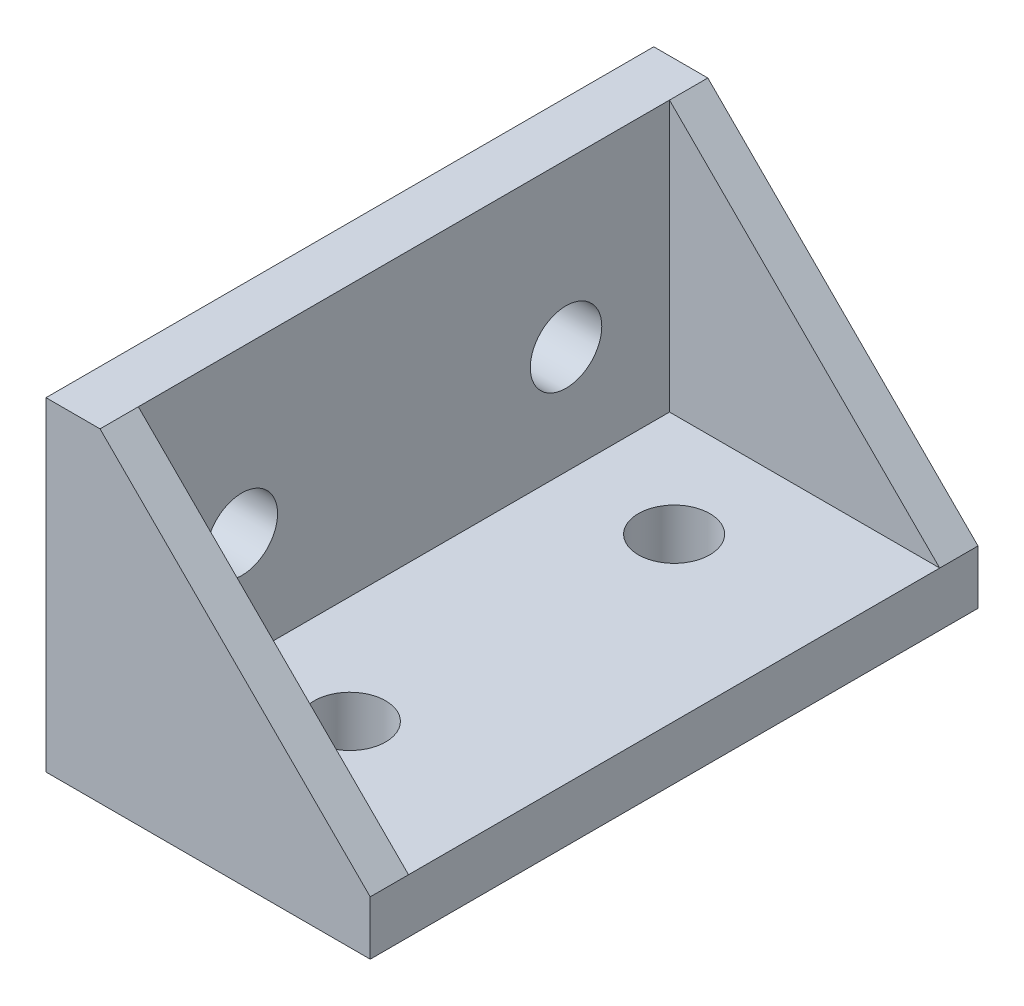
ISO-10303-21;
HEADER;
FILE_DESCRIPTION(('STEP AP214'),'2;1');
FILE_NAME('part.step','',(''),(''),'','','');
FILE_SCHEMA(('AUTOMOTIVE_DESIGN { 1 0 10303 214 1 1 1 1 }'));
ENDSEC;
DATA;
#1=APPLICATION_CONTEXT('core data for automotive mechanical design processes');
#2=APPLICATION_PROTOCOL_DEFINITION('international standard','automotive_design',2000,#1);
#3=PRODUCT_CONTEXT('',#1,'mechanical');
#4=PRODUCT('Part','Part','',(#3));
#5=PRODUCT_RELATED_PRODUCT_CATEGORY('part','',(#4));
#6=PRODUCT_DEFINITION_FORMATION('','',#4);
#7=PRODUCT_DEFINITION_CONTEXT('part definition',#1,'design');
#8=PRODUCT_DEFINITION('design','',#6,#7);
#9=PRODUCT_DEFINITION_SHAPE('','',#8);
#10=(LENGTH_UNIT() NAMED_UNIT(*) SI_UNIT(.MILLI.,.METRE.));
#11=(NAMED_UNIT(*) PLANE_ANGLE_UNIT() SI_UNIT($,.RADIAN.));
#12=(NAMED_UNIT(*) SI_UNIT($,.STERADIAN.) SOLID_ANGLE_UNIT());
#13=UNCERTAINTY_MEASURE_WITH_UNIT(LENGTH_MEASURE(1.E-05),#10,'distance_accuracy_value','');
#14=(GEOMETRIC_REPRESENTATION_CONTEXT(3) GLOBAL_UNCERTAINTY_ASSIGNED_CONTEXT((#13)) GLOBAL_UNIT_ASSIGNED_CONTEXT((#10,
#11,#12)) REPRESENTATION_CONTEXT('',''));
#15=CARTESIAN_POINT('',(0.,0.,0.));
#16=DIRECTION('',(0.,0.,1.));
#17=DIRECTION('',(1.,0.,0.));
#18=AXIS2_PLACEMENT_3D('',#15,#16,#17);
#19=CARTESIAN_POINT('',(38.1,6.35,35.71));
#20=DIRECTION('',(-0.707106781186548,-0.707106781186548,0.));
#21=DIRECTION('',(0.707106781186548,-0.707106781186548,0.));
#22=AXIS2_PLACEMENT_3D('',#19,#20,#21);
#23=PLANE('',#22);
#24=DIRECTION('',(-0.707106781186548,0.707106781186548,0.));
#25=VECTOR('',#24,1.);
#26=CARTESIAN_POINT('',(38.1,6.35,-31.21));
#27=LINE('',#26,#25);
#28=CARTESIAN_POINT('',(38.1,6.35,-31.21));
#29=VERTEX_POINT('',#28);
#30=CARTESIAN_POINT('',(6.35,38.1,-31.21));
#31=VERTEX_POINT('',#30);
#32=EDGE_CURVE('E11',#29,#31,#27,.T.);
#33=ORIENTED_EDGE('',*,*,#32,.F.);
#34=DIRECTION('',(0.,0.,-1.));
#35=VECTOR('',#34,1.);
#36=CARTESIAN_POINT('',(38.1,6.35,35.71));
#37=LINE('',#36,#35);
#38=CARTESIAN_POINT('',(38.1,6.35,-35.71));
#39=VERTEX_POINT('',#38);
#40=EDGE_CURVE('E122',#29,#39,#37,.T.);
#41=ORIENTED_EDGE('',*,*,#40,.T.);
#42=DIRECTION('',(-0.707106781186548,0.707106781186548,0.));
#43=VECTOR('',#42,1.);
#44=CARTESIAN_POINT('',(38.1,6.35,-35.71));
#45=LINE('',#44,#43);
#46=CARTESIAN_POINT('',(6.35,38.1,-35.71));
#47=VERTEX_POINT('',#46);
#48=EDGE_CURVE('E139',#39,#47,#45,.T.);
#49=ORIENTED_EDGE('',*,*,#48,.T.);
#50=DIRECTION('',(0.,0.,-1.));
#51=VECTOR('',#50,1.);
#52=CARTESIAN_POINT('',(6.35,38.1,35.71));
#53=LINE('',#52,#51);
#54=EDGE_CURVE('E145',#31,#47,#53,.T.);
#55=ORIENTED_EDGE('',*,*,#54,.F.);
#56=EDGE_LOOP('',(#33,#41,#49,#55));
#57=FACE_BOUND('',#56,.T.);
#58=ADVANCED_FACE('F39',(#57),#23,.F.);
#59=CARTESIAN_POINT('',(0.,38.1,35.71));
#60=DIRECTION('',(1.,0.,0.));
#61=DIRECTION('',(0.,0.,-1.));
#62=AXIS2_PLACEMENT_3D('',#59,#60,#61);
#63=PLANE('',#62);
#64=CARTESIAN_POINT('',(0.,19.05,-19.05));
#65=DIRECTION('',(1.,0.,0.));
#66=DIRECTION('',(0.,0.,-1.));
#67=AXIS2_PLACEMENT_3D('',#64,#65,#66);
#68=CIRCLE('',#67,4.2);
#69=CARTESIAN_POINT('',(0.,19.05,-23.25));
#70=VERTEX_POINT('',#69);
#71=EDGE_CURVE('E182',#70,#70,#68,.T.);
#72=ORIENTED_EDGE('',*,*,#71,.T.);
#73=EDGE_LOOP('',(#72));
#74=FACE_BOUND('',#73,.T.);
#75=CARTESIAN_POINT('',(0.,19.05,19.05));
#76=DIRECTION('',(1.,0.,0.));
#77=DIRECTION('',(0.,0.,-1.));
#78=AXIS2_PLACEMENT_3D('',#75,#76,#77);
#79=CIRCLE('',#78,4.2);
#80=CARTESIAN_POINT('',(0.,19.05,14.85));
#81=VERTEX_POINT('',#80);
#82=EDGE_CURVE('E190',#81,#81,#79,.T.);
#83=ORIENTED_EDGE('',*,*,#82,.T.);
#84=EDGE_LOOP('',(#83));
#85=FACE_BOUND('',#84,.T.);
#86=DIRECTION('',(0.,-1.,0.));
#87=VECTOR('',#86,1.);
#88=CARTESIAN_POINT('',(0.,38.1,-35.71));
#89=LINE('',#88,#87);
#90=CARTESIAN_POINT('',(0.,38.1,-35.71));
#91=VERTEX_POINT('',#90);
#92=CARTESIAN_POINT('',(0.,0.,-35.71));
#93=VERTEX_POINT('',#92);
#94=EDGE_CURVE('E131',#91,#93,#89,.T.);
#95=ORIENTED_EDGE('',*,*,#94,.T.);
#96=DIRECTION('',(0.,0.,-1.));
#97=VECTOR('',#96,1.);
#98=CARTESIAN_POINT('',(0.,0.,35.71));
#99=LINE('',#98,#97);
#100=CARTESIAN_POINT('',(0.,0.,35.71));
#101=VERTEX_POINT('',#100);
#102=EDGE_CURVE('E149',#101,#93,#99,.T.);
#103=ORIENTED_EDGE('',*,*,#102,.F.);
#104=DIRECTION('',(0.,-1.,0.));
#105=VECTOR('',#104,1.);
#106=CARTESIAN_POINT('',(0.,38.1,35.71));
#107=LINE('',#106,#105);
#108=CARTESIAN_POINT('',(0.,38.1,35.71));
#109=VERTEX_POINT('',#108);
#110=EDGE_CURVE('E143',#109,#101,#107,.T.);
#111=ORIENTED_EDGE('',*,*,#110,.F.);
#112=DIRECTION('',(0.,0.,-1.));
#113=VECTOR('',#112,1.);
#114=CARTESIAN_POINT('',(0.,38.1,35.71));
#115=LINE('',#114,#113);
#116=EDGE_CURVE('E127',#109,#91,#115,.T.);
#117=ORIENTED_EDGE('',*,*,#116,.T.);
#118=EDGE_LOOP('',(#95,#103,#111,#117));
#119=FACE_BOUND('',#118,.T.);
#120=ADVANCED_FACE('F41',(#74,#85,#119),#63,.F.);
#121=CARTESIAN_POINT('',(0.,0.,35.71));
#122=DIRECTION('',(0.,1.,0.));
#123=DIRECTION('',(0.,0.,1.));
#124=AXIS2_PLACEMENT_3D('',#121,#122,#123);
#125=PLANE('',#124);
#126=CARTESIAN_POINT('',(19.05,0.,-19.05));
#127=DIRECTION('',(0.,1.,0.));
#128=DIRECTION('',(0.,0.,1.));
#129=AXIS2_PLACEMENT_3D('',#126,#127,#128);
#130=CIRCLE('',#129,4.2);
#131=CARTESIAN_POINT('',(19.05,0.,-14.85));
#132=VERTEX_POINT('',#131);
#133=EDGE_CURVE('E174',#132,#132,#130,.T.);
#134=ORIENTED_EDGE('',*,*,#133,.T.);
#135=EDGE_LOOP('',(#134));
#136=FACE_BOUND('',#135,.T.);
#137=CARTESIAN_POINT('',(19.05,0.,19.05));
#138=DIRECTION('',(0.,1.,0.));
#139=DIRECTION('',(0.,0.,1.));
#140=AXIS2_PLACEMENT_3D('',#137,#138,#139);
#141=CIRCLE('',#140,4.2);
#142=CARTESIAN_POINT('',(19.05,0.,23.25));
#143=VERTEX_POINT('',#142);
#144=EDGE_CURVE('E178',#143,#143,#141,.T.);
#145=ORIENTED_EDGE('',*,*,#144,.T.);
#146=EDGE_LOOP('',(#145));
#147=FACE_BOUND('',#146,.T.);
#148=DIRECTION('',(1.,0.,0.));
#149=VECTOR('',#148,1.);
#150=CARTESIAN_POINT('',(0.,0.,-35.71));
#151=LINE('',#150,#149);
#152=CARTESIAN_POINT('',(38.1,0.,-35.71));
#153=VERTEX_POINT('',#152);
#154=EDGE_CURVE('E134',#93,#153,#151,.T.);
#155=ORIENTED_EDGE('',*,*,#154,.T.);
#156=DIRECTION('',(0.,0.,-1.));
#157=VECTOR('',#156,1.);
#158=CARTESIAN_POINT('',(38.1,0.,35.71));
#159=LINE('',#158,#157);
#160=CARTESIAN_POINT('',(38.1,0.,35.71));
#161=VERTEX_POINT('',#160);
#162=EDGE_CURVE('E120',#161,#153,#159,.T.);
#163=ORIENTED_EDGE('',*,*,#162,.F.);
#164=DIRECTION('',(1.,0.,0.));
#165=VECTOR('',#164,1.);
#166=CARTESIAN_POINT('',(0.,0.,35.71));
#167=LINE('',#166,#165);
#168=EDGE_CURVE('E94',#101,#161,#167,.T.);
#169=ORIENTED_EDGE('',*,*,#168,.F.);
#170=ORIENTED_EDGE('',*,*,#102,.T.);
#171=EDGE_LOOP('',(#155,#163,#169,#170));
#172=FACE_BOUND('',#171,.T.);
#173=ADVANCED_FACE('F241',(#136,#147,#172),#125,.F.);
#174=CARTESIAN_POINT('',(38.1,0.,35.71));
#175=DIRECTION('',(-1.,0.,0.));
#176=DIRECTION('',(0.,0.,1.));
#177=AXIS2_PLACEMENT_3D('',#174,#175,#176);
#178=PLANE('',#177);
#179=DIRECTION('',(0.,1.,0.));
#180=VECTOR('',#179,1.);
#181=CARTESIAN_POINT('',(38.1,0.,-35.71));
#182=LINE('',#181,#180);
#183=EDGE_CURVE('E137',#153,#39,#182,.T.);
#184=ORIENTED_EDGE('',*,*,#183,.T.);
#185=ORIENTED_EDGE('',*,*,#40,.F.);
#186=CARTESIAN_POINT('',(38.1,6.35,31.21));
#187=VERTEX_POINT('',#186);
#188=EDGE_CURVE('E117',#187,#29,#37,.T.);
#189=ORIENTED_EDGE('',*,*,#188,.F.);
#190=CARTESIAN_POINT('',(38.1,6.35,35.71));
#191=VERTEX_POINT('',#190);
#192=EDGE_CURVE('E111',#191,#187,#37,.T.);
#193=ORIENTED_EDGE('',*,*,#192,.F.);
#194=DIRECTION('',(0.,1.,0.));
#195=VECTOR('',#194,1.);
#196=CARTESIAN_POINT('',(38.1,0.,35.71));
#197=LINE('',#196,#195);
#198=EDGE_CURVE('E100',#161,#191,#197,.T.);
#199=ORIENTED_EDGE('',*,*,#198,.F.);
#200=ORIENTED_EDGE('',*,*,#162,.T.);
#201=EDGE_LOOP('',(#184,#185,#189,#193,#199,#200));
#202=FACE_BOUND('',#201,.T.);
#203=ADVANCED_FACE('F113',(#202),#178,.F.);
#204=ORIENTED_EDGE('',*,*,#192,.T.);
#205=DIRECTION('',(-0.707106781186548,0.707106781186548,0.));
#206=VECTOR('',#205,1.);
#207=CARTESIAN_POINT('',(38.1,6.35,31.21));
#208=LINE('',#207,#206);
#209=CARTESIAN_POINT('',(6.35,38.1,31.21));
#210=VERTEX_POINT('',#209);
#211=EDGE_CURVE('E47',#187,#210,#208,.T.);
#212=ORIENTED_EDGE('',*,*,#211,.T.);
#213=CARTESIAN_POINT('',(6.35,38.1,35.71));
#214=VERTEX_POINT('',#213);
#215=EDGE_CURVE('E125',#214,#210,#53,.T.);
#216=ORIENTED_EDGE('',*,*,#215,.F.);
#217=DIRECTION('',(-0.707106781186548,0.707106781186548,0.));
#218=VECTOR('',#217,1.);
#219=CARTESIAN_POINT('',(38.1,6.35,35.71));
#220=LINE('',#219,#218);
#221=EDGE_CURVE('E104',#191,#214,#220,.T.);
#222=ORIENTED_EDGE('',*,*,#221,.F.);
#223=EDGE_LOOP('',(#204,#212,#216,#222));
#224=FACE_BOUND('',#223,.T.);
#225=ADVANCED_FACE('F123',(#224),#23,.F.);
#226=CARTESIAN_POINT('',(6.35,38.1,35.71));
#227=DIRECTION('',(0.,-1.,0.));
#228=DIRECTION('',(0.,0.,-1.));
#229=AXIS2_PLACEMENT_3D('',#226,#227,#228);
#230=PLANE('',#229);
#231=DIRECTION('',(-1.,0.,0.));
#232=VECTOR('',#231,1.);
#233=CARTESIAN_POINT('',(6.35,38.1,-35.71));
#234=LINE('',#233,#232);
#235=EDGE_CURVE('E85',#47,#91,#234,.T.);
#236=ORIENTED_EDGE('',*,*,#235,.T.);
#237=ORIENTED_EDGE('',*,*,#116,.F.);
#238=DIRECTION('',(-1.,0.,0.));
#239=VECTOR('',#238,1.);
#240=CARTESIAN_POINT('',(6.35,38.1,35.71));
#241=LINE('',#240,#239);
#242=EDGE_CURVE('E62',#214,#109,#241,.T.);
#243=ORIENTED_EDGE('',*,*,#242,.F.);
#244=ORIENTED_EDGE('',*,*,#215,.T.);
#245=EDGE_CURVE('E146',#210,#31,#53,.T.);
#246=ORIENTED_EDGE('',*,*,#245,.T.);
#247=ORIENTED_EDGE('',*,*,#54,.T.);
#248=EDGE_LOOP('',(#236,#237,#243,#244,#246,#247));
#249=FACE_BOUND('',#248,.T.);
#250=ADVANCED_FACE('F159',(#249),#230,.F.);
#251=CARTESIAN_POINT('',(0.,0.,35.71));
#252=DIRECTION('',(0.,0.,1.));
#253=DIRECTION('',(1.,0.,0.));
#254=AXIS2_PLACEMENT_3D('',#251,#252,#253);
#255=PLANE('',#254);
#256=ORIENTED_EDGE('',*,*,#110,.T.);
#257=ORIENTED_EDGE('',*,*,#168,.T.);
#258=ORIENTED_EDGE('',*,*,#198,.T.);
#259=ORIENTED_EDGE('',*,*,#221,.T.);
#260=ORIENTED_EDGE('',*,*,#242,.T.);
#261=EDGE_LOOP('',(#256,#257,#258,#259,#260));
#262=FACE_BOUND('',#261,.T.);
#263=ADVANCED_FACE('F102',(#262),#255,.T.);
#264=CARTESIAN_POINT('',(0.,0.,-35.71));
#265=DIRECTION('',(0.,0.,1.));
#266=DIRECTION('',(1.,0.,0.));
#267=AXIS2_PLACEMENT_3D('',#264,#265,#266);
#268=PLANE('',#267);
#269=ORIENTED_EDGE('',*,*,#94,.F.);
#270=ORIENTED_EDGE('',*,*,#235,.F.);
#271=ORIENTED_EDGE('',*,*,#48,.F.);
#272=ORIENTED_EDGE('',*,*,#183,.F.);
#273=ORIENTED_EDGE('',*,*,#154,.F.);
#274=EDGE_LOOP('',(#269,#270,#271,#272,#273));
#275=FACE_BOUND('',#274,.T.);
#276=ADVANCED_FACE('F261',(#275),#268,.F.);
#277=CARTESIAN_POINT('',(6.35,6.35,-31.21));
#278=DIRECTION('',(0.,-1.,0.));
#279=DIRECTION('',(0.,0.,-1.));
#280=AXIS2_PLACEMENT_3D('',#277,#278,#279);
#281=PLANE('',#280);
#282=CARTESIAN_POINT('',(19.05,6.35,-19.05));
#283=DIRECTION('',(0.,1.,0.));
#284=DIRECTION('',(0.,0.,1.));
#285=AXIS2_PLACEMENT_3D('',#282,#283,#284);
#286=CIRCLE('',#285,4.2);
#287=CARTESIAN_POINT('',(19.05,6.35,-14.85));
#288=VERTEX_POINT('',#287);
#289=EDGE_CURVE('E185',#288,#288,#286,.T.);
#290=ORIENTED_EDGE('',*,*,#289,.F.);
#291=EDGE_LOOP('',(#290));
#292=FACE_BOUND('',#291,.T.);
#293=CARTESIAN_POINT('',(19.05,6.35,19.05));
#294=DIRECTION('',(0.,1.,0.));
#295=DIRECTION('',(0.,0.,1.));
#296=AXIS2_PLACEMENT_3D('',#293,#294,#295);
#297=CIRCLE('',#296,4.2);
#298=CARTESIAN_POINT('',(19.05,6.35,23.25));
#299=VERTEX_POINT('',#298);
#300=EDGE_CURVE('E181',#299,#299,#297,.T.);
#301=ORIENTED_EDGE('',*,*,#300,.F.);
#302=EDGE_LOOP('',(#301));
#303=FACE_BOUND('',#302,.T.);
#304=DIRECTION('',(1.,0.,0.));
#305=VECTOR('',#304,1.);
#306=CARTESIAN_POINT('',(6.35,6.35,-31.21));
#307=LINE('',#306,#305);
#308=CARTESIAN_POINT('',(6.35,6.35,-31.21));
#309=VERTEX_POINT('',#308);
#310=EDGE_CURVE('E168',#309,#29,#307,.T.);
#311=ORIENTED_EDGE('',*,*,#310,.F.);
#312=DIRECTION('',(0.,0.,1.));
#313=VECTOR('',#312,1.);
#314=CARTESIAN_POINT('',(6.35,6.35,-31.21));
#315=LINE('',#314,#313);
#316=CARTESIAN_POINT('',(6.35,6.35,31.21));
#317=VERTEX_POINT('',#316);
#318=EDGE_CURVE('E135',#309,#317,#315,.T.);
#319=ORIENTED_EDGE('',*,*,#318,.T.);
#320=DIRECTION('',(1.,0.,0.));
#321=VECTOR('',#320,1.);
#322=CARTESIAN_POINT('',(6.35,6.35,31.21));
#323=LINE('',#322,#321);
#324=EDGE_CURVE('E169',#317,#187,#323,.T.);
#325=ORIENTED_EDGE('',*,*,#324,.T.);
#326=ORIENTED_EDGE('',*,*,#188,.T.);
#327=EDGE_LOOP('',(#311,#319,#325,#326));
#328=FACE_BOUND('',#327,.T.);
#329=ADVANCED_FACE('F222',(#292,#303,#328),#281,.F.);
#330=CARTESIAN_POINT('',(0.,0.,-31.21));
#331=DIRECTION('',(0.,0.,1.));
#332=DIRECTION('',(1.,0.,0.));
#333=AXIS2_PLACEMENT_3D('',#330,#331,#332);
#334=PLANE('',#333);
#335=ORIENTED_EDGE('',*,*,#32,.T.);
#336=DIRECTION('',(0.,-1.,0.));
#337=VECTOR('',#336,1.);
#338=CARTESIAN_POINT('',(6.35,48.1,-31.21));
#339=LINE('',#338,#337);
#340=EDGE_CURVE('E54',#31,#309,#339,.T.);
#341=ORIENTED_EDGE('',*,*,#340,.T.);
#342=ORIENTED_EDGE('',*,*,#310,.T.);
#343=EDGE_LOOP('',(#335,#341,#342));
#344=FACE_BOUND('',#343,.T.);
#345=ADVANCED_FACE('F224',(#344),#334,.T.);
#346=CARTESIAN_POINT('',(0.,0.,31.21));
#347=DIRECTION('',(0.,0.,1.));
#348=DIRECTION('',(1.,0.,0.));
#349=AXIS2_PLACEMENT_3D('',#346,#347,#348);
#350=PLANE('',#349);
#351=ORIENTED_EDGE('',*,*,#324,.F.);
#352=DIRECTION('',(0.,-1.,0.));
#353=VECTOR('',#352,1.);
#354=CARTESIAN_POINT('',(6.35,48.1,31.21));
#355=LINE('',#354,#353);
#356=EDGE_CURVE('E171',#210,#317,#355,.T.);
#357=ORIENTED_EDGE('',*,*,#356,.F.);
#358=ORIENTED_EDGE('',*,*,#211,.F.);
#359=EDGE_LOOP('',(#351,#357,#358));
#360=FACE_BOUND('',#359,.T.);
#361=ADVANCED_FACE('F215',(#360),#350,.F.);
#362=CARTESIAN_POINT('',(6.35,48.1,-31.21));
#363=DIRECTION('',(-1.,0.,0.));
#364=DIRECTION('',(0.,0.,1.));
#365=AXIS2_PLACEMENT_3D('',#362,#363,#364);
#366=PLANE('',#365);
#367=CARTESIAN_POINT('',(6.35,19.05,-19.05));
#368=DIRECTION('',(1.,0.,0.));
#369=DIRECTION('',(0.,0.,-1.));
#370=AXIS2_PLACEMENT_3D('',#367,#368,#369);
#371=CIRCLE('',#370,4.2);
#372=CARTESIAN_POINT('',(6.35,19.05,-23.25));
#373=VERTEX_POINT('',#372);
#374=EDGE_CURVE('E196',#373,#373,#371,.T.);
#375=ORIENTED_EDGE('',*,*,#374,.F.);
#376=EDGE_LOOP('',(#375));
#377=FACE_BOUND('',#376,.T.);
#378=CARTESIAN_POINT('',(6.35,19.05,19.05));
#379=DIRECTION('',(1.,0.,0.));
#380=DIRECTION('',(0.,0.,-1.));
#381=AXIS2_PLACEMENT_3D('',#378,#379,#380);
#382=CIRCLE('',#381,4.2);
#383=CARTESIAN_POINT('',(6.35,19.05,14.85));
#384=VERTEX_POINT('',#383);
#385=EDGE_CURVE('E193',#384,#384,#382,.T.);
#386=ORIENTED_EDGE('',*,*,#385,.F.);
#387=EDGE_LOOP('',(#386));
#388=FACE_BOUND('',#387,.T.);
#389=ORIENTED_EDGE('',*,*,#356,.T.);
#390=ORIENTED_EDGE('',*,*,#318,.F.);
#391=ORIENTED_EDGE('',*,*,#340,.F.);
#392=ORIENTED_EDGE('',*,*,#245,.F.);
#393=EDGE_LOOP('',(#389,#390,#391,#392));
#394=FACE_BOUND('',#393,.T.);
#395=ADVANCED_FACE('F211',(#377,#388,#394),#366,.F.);
#396=CARTESIAN_POINT('',(19.05,0.,19.05));
#397=DIRECTION('',(0.,1.,0.));
#398=DIRECTION('',(0.,0.,1.));
#399=AXIS2_PLACEMENT_3D('',#396,#397,#398);
#400=CYLINDRICAL_SURFACE('',#399,4.2);
#401=ORIENTED_EDGE('',*,*,#144,.F.);
#402=EDGE_LOOP('',(#401));
#403=FACE_BOUND('',#402,.T.);
#404=ORIENTED_EDGE('',*,*,#300,.T.);
#405=EDGE_LOOP('',(#404));
#406=FACE_BOUND('',#405,.T.);
#407=ADVANCED_FACE('F214',(#403,#406),#400,.F.);
#408=CARTESIAN_POINT('',(19.05,0.,-19.05));
#409=DIRECTION('',(0.,1.,0.));
#410=DIRECTION('',(0.,0.,1.));
#411=AXIS2_PLACEMENT_3D('',#408,#409,#410);
#412=CYLINDRICAL_SURFACE('',#411,4.2);
#413=ORIENTED_EDGE('',*,*,#133,.F.);
#414=EDGE_LOOP('',(#413));
#415=FACE_BOUND('',#414,.T.);
#416=ORIENTED_EDGE('',*,*,#289,.T.);
#417=EDGE_LOOP('',(#416));
#418=FACE_BOUND('',#417,.T.);
#419=ADVANCED_FACE('F317',(#415,#418),#412,.F.);
#420=CARTESIAN_POINT('',(0.,19.05,19.05));
#421=DIRECTION('',(1.,0.,0.));
#422=DIRECTION('',(0.,0.,-1.));
#423=AXIS2_PLACEMENT_3D('',#420,#421,#422);
#424=CYLINDRICAL_SURFACE('',#423,4.2);
#425=ORIENTED_EDGE('',*,*,#82,.F.);
#426=EDGE_LOOP('',(#425));
#427=FACE_BOUND('',#426,.T.);
#428=ORIENTED_EDGE('',*,*,#385,.T.);
#429=EDGE_LOOP('',(#428));
#430=FACE_BOUND('',#429,.T.);
#431=ADVANCED_FACE('F207',(#427,#430),#424,.F.);
#432=CARTESIAN_POINT('',(0.,19.05,-19.05));
#433=DIRECTION('',(1.,0.,0.));
#434=DIRECTION('',(0.,0.,-1.));
#435=AXIS2_PLACEMENT_3D('',#432,#433,#434);
#436=CYLINDRICAL_SURFACE('',#435,4.2);
#437=ORIENTED_EDGE('',*,*,#71,.F.);
#438=EDGE_LOOP('',(#437));
#439=FACE_BOUND('',#438,.T.);
#440=ORIENTED_EDGE('',*,*,#374,.T.);
#441=EDGE_LOOP('',(#440));
#442=FACE_BOUND('',#441,.T.);
#443=ADVANCED_FACE('F204',(#439,#442),#436,.F.);
#444=CLOSED_SHELL('',(#58,#120,#173,#203,#225,#250,#263,#276,#329,#345,#361,#395,#407,#419,#431,#443));
#445=MANIFOLD_SOLID_BREP('B2',#444);
#446=ADVANCED_BREP_SHAPE_REPRESENTATION('',(#18,#445),#14);
#447=SHAPE_DEFINITION_REPRESENTATION(#9,#446);
ENDSEC;
END-ISO-10303-21;
